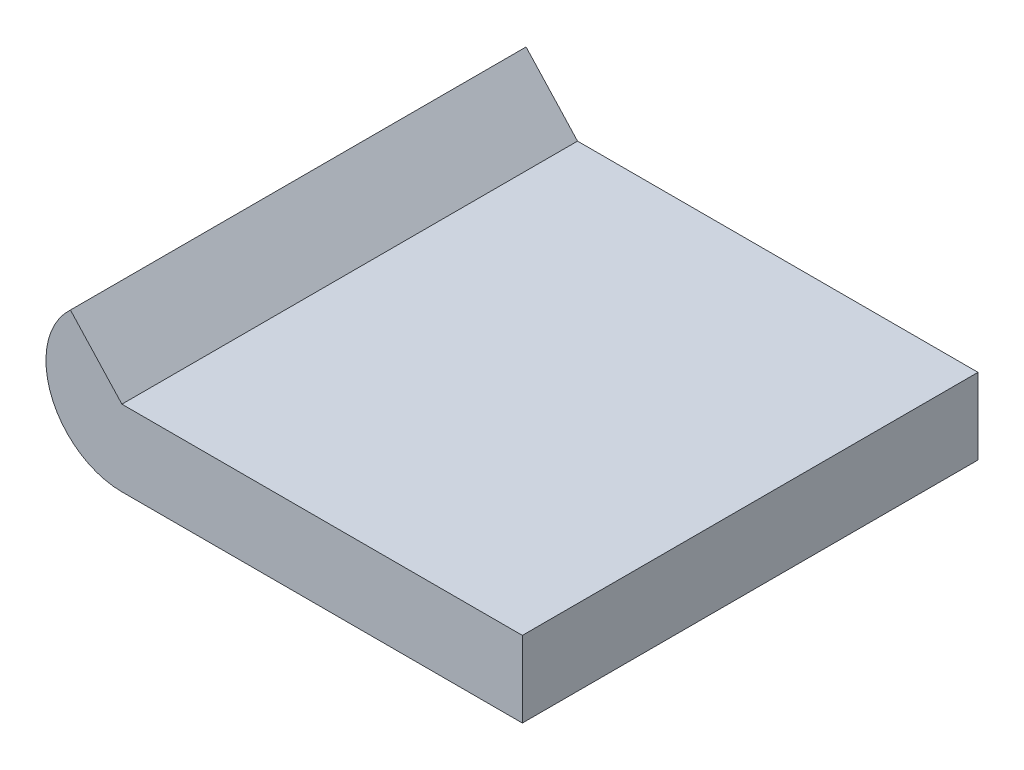
ISO-10303-21;
HEADER;
FILE_DESCRIPTION(('STEP AP214'),'2;1');
FILE_NAME('part.step','',(''),(''),'','','');
FILE_SCHEMA(('AUTOMOTIVE_DESIGN { 1 0 10303 214 1 1 1 1 }'));
ENDSEC;
DATA;
#1=APPLICATION_CONTEXT('core data for automotive mechanical design processes');
#2=APPLICATION_PROTOCOL_DEFINITION('international standard','automotive_design',2000,#1);
#3=PRODUCT_CONTEXT('',#1,'mechanical');
#4=PRODUCT('Part','Part','',(#3));
#5=PRODUCT_RELATED_PRODUCT_CATEGORY('part','',(#4));
#6=PRODUCT_DEFINITION_FORMATION('','',#4);
#7=PRODUCT_DEFINITION_CONTEXT('part definition',#1,'design');
#8=PRODUCT_DEFINITION('design','',#6,#7);
#9=PRODUCT_DEFINITION_SHAPE('','',#8);
#10=(LENGTH_UNIT() NAMED_UNIT(*) SI_UNIT(.MILLI.,.METRE.));
#11=(NAMED_UNIT(*) PLANE_ANGLE_UNIT() SI_UNIT($,.RADIAN.));
#12=(NAMED_UNIT(*) SI_UNIT($,.STERADIAN.) SOLID_ANGLE_UNIT());
#13=UNCERTAINTY_MEASURE_WITH_UNIT(LENGTH_MEASURE(1.E-05),#10,'distance_accuracy_value','');
#14=(GEOMETRIC_REPRESENTATION_CONTEXT(3) GLOBAL_UNCERTAINTY_ASSIGNED_CONTEXT((#13)) GLOBAL_UNIT_ASSIGNED_CONTEXT((#10,
#11,#12)) REPRESENTATION_CONTEXT('',''));
#15=CARTESIAN_POINT('',(0.,0.,0.));
#16=DIRECTION('',(0.,0.,1.));
#17=DIRECTION('',(1.,0.,0.));
#18=AXIS2_PLACEMENT_3D('',#15,#16,#17);
#19=CARTESIAN_POINT('',(-123.82,19.8853755359338,3.));
#20=DIRECTION('',(0.,1.,0.));
#21=DIRECTION('',(-1.,0.,0.));
#22=AXIS2_PLACEMENT_3D('',#19,#20,#21);
#23=PLANE('',#22);
#24=DIRECTION('',(1.,0.,0.));
#25=VECTOR('',#24,1.);
#26=CARTESIAN_POINT('',(-336.32,19.8853755359338,0.));
#27=LINE('',#26,#25);
#28=CARTESIAN_POINT('',(-116.140375406953,19.8853755359338,0.));
#29=VERTEX_POINT('',#28);
#30=CARTESIAN_POINT('',(-100.32,19.8853755359338,0.));
#31=VERTEX_POINT('',#30);
#32=EDGE_CURVE('E1726',#29,#31,#27,.T.);
#33=ORIENTED_EDGE('',*,*,#32,.T.);
#34=DIRECTION('',(0.,0.,1.));
#35=VECTOR('',#34,1.);
#36=CARTESIAN_POINT('',(-100.32,19.8853755359338,-18.87));
#37=LINE('',#36,#35);
#38=CARTESIAN_POINT('',(-100.32,19.8853755359338,18.));
#39=VERTEX_POINT('',#38);
#40=EDGE_CURVE('E1716',#31,#39,#37,.T.);
#41=ORIENTED_EDGE('',*,*,#40,.T.);
#42=DIRECTION('',(-1.,0.,0.));
#43=VECTOR('',#42,1.);
#44=CARTESIAN_POINT('',(-103.32,19.8853755359338,18.));
#45=LINE('',#44,#43);
#46=CARTESIAN_POINT('',(-116.140375406952,19.8853755359338,18.));
#47=VERTEX_POINT('',#46);
#48=EDGE_CURVE('E1720',#39,#47,#45,.T.);
#49=ORIENTED_EDGE('',*,*,#48,.T.);
#50=DIRECTION('',(0.,0.,-1.));
#51=VECTOR('',#50,1.);
#52=CARTESIAN_POINT('',(-116.140375406953,19.8853755359338,3.));
#53=LINE('',#52,#51);
#54=EDGE_CURVE('E1657',#47,#29,#53,.T.);
#55=ORIENTED_EDGE('',*,*,#54,.T.);
#56=EDGE_LOOP('',(#33,#41,#49,#55));
#57=FACE_BOUND('',#56,.T.);
#58=ADVANCED_FACE('F1642',(#57),#23,.F.);
#59=CARTESIAN_POINT('',(-100.32,22.8853755359338,-18.87));
#60=DIRECTION('',(-1.,0.,0.));
#61=DIRECTION('',(0.,-1.,0.));
#62=AXIS2_PLACEMENT_3D('',#59,#60,#61);
#63=PLANE('',#62);
#64=DIRECTION('',(0.,-1.,0.));
#65=VECTOR('',#64,1.);
#66=CARTESIAN_POINT('',(-100.32,22.8853755359338,0.));
#67=LINE('',#66,#65);
#68=CARTESIAN_POINT('',(-100.32,22.8853755359338,0.));
#69=VERTEX_POINT('',#68);
#70=EDGE_CURVE('E1870',#69,#31,#67,.T.);
#71=ORIENTED_EDGE('',*,*,#70,.F.);
#72=DIRECTION('',(0.,0.,1.));
#73=VECTOR('',#72,1.);
#74=CARTESIAN_POINT('',(-100.32,22.8853755359338,-18.87));
#75=LINE('',#74,#73);
#76=CARTESIAN_POINT('',(-100.32,22.8853755359338,18.));
#77=VERTEX_POINT('',#76);
#78=EDGE_CURVE('E1665',#69,#77,#75,.T.);
#79=ORIENTED_EDGE('',*,*,#78,.T.);
#80=DIRECTION('',(0.,-1.,0.));
#81=VECTOR('',#80,1.);
#82=CARTESIAN_POINT('',(-100.32,-113.114624464066,18.));
#83=LINE('',#82,#81);
#84=EDGE_CURVE('E1710',#77,#39,#83,.T.);
#85=ORIENTED_EDGE('',*,*,#84,.T.);
#86=ORIENTED_EDGE('',*,*,#40,.F.);
#87=EDGE_LOOP('',(#71,#79,#85,#86));
#88=FACE_BOUND('',#87,.T.);
#89=ADVANCED_FACE('F1732',(#88),#63,.F.);
#90=CARTESIAN_POINT('',(-116.140375406953,22.8853755359338,3.));
#91=DIRECTION('',(0.,0.,-1.));
#92=DIRECTION('',(-1.,0.,0.));
#93=AXIS2_PLACEMENT_3D('',#90,#91,#92);
#94=CYLINDRICAL_SURFACE('',#93,3.);
#95=ORIENTED_EDGE('',*,*,#54,.F.);
#96=CARTESIAN_POINT('',(-116.140375406953,22.8853755359338,18.));
#97=DIRECTION('',(0.,0.,-1.));
#98=DIRECTION('',(-1.,0.,0.));
#99=AXIS2_PLACEMENT_3D('',#96,#97,#98);
#100=CIRCLE('',#99,3.);
#101=CARTESIAN_POINT('',(-118.173915974705,25.0909849209576,18.));
#102=VERTEX_POINT('',#101);
#103=EDGE_CURVE('E1701',#47,#102,#100,.T.);
#104=ORIENTED_EDGE('',*,*,#103,.T.);
#105=DIRECTION('',(0.,0.,-1.));
#106=VECTOR('',#105,1.);
#107=CARTESIAN_POINT('',(-118.173915974705,25.0909849209576,3.));
#108=LINE('',#107,#106);
#109=CARTESIAN_POINT('',(-118.173915974705,25.0909849209576,0.));
#110=VERTEX_POINT('',#109);
#111=EDGE_CURVE('E13',#110,#102,#108,.F.);
#112=ORIENTED_EDGE('',*,*,#111,.F.);
#113=CARTESIAN_POINT('',(-116.140375406953,22.8853755359338,0.));
#114=DIRECTION('',(0.,0.,-1.));
#115=DIRECTION('',(-1.,0.,0.));
#116=AXIS2_PLACEMENT_3D('',#113,#114,#115);
#117=CIRCLE('',#116,3.);
#118=EDGE_CURVE('E1650',#29,#110,#117,.T.);
#119=ORIENTED_EDGE('',*,*,#118,.F.);
#120=EDGE_LOOP('',(#95,#104,#112,#119));
#121=FACE_BOUND('',#120,.T.);
#122=ADVANCED_FACE('F1644',(#121),#94,.T.);
#123=CARTESIAN_POINT('',(-100.32,22.8853755359338,-18.87));
#124=DIRECTION('',(0.,1.,0.));
#125=DIRECTION('',(0.,0.,1.));
#126=AXIS2_PLACEMENT_3D('',#123,#124,#125);
#127=PLANE('',#126);
#128=ORIENTED_EDGE('',*,*,#78,.F.);
#129=DIRECTION('',(1.,0.,0.));
#130=VECTOR('',#129,1.);
#131=CARTESIAN_POINT('',(-100.32,22.8853755359338,0.));
#132=LINE('',#131,#130);
#133=CARTESIAN_POINT('',(-116.140375406953,22.8853755359338,0.));
#134=VERTEX_POINT('',#133);
#135=EDGE_CURVE('E1702',#134,#69,#132,.T.);
#136=ORIENTED_EDGE('',*,*,#135,.F.);
#137=DIRECTION('',(0.,0.,1.));
#138=VECTOR('',#137,1.);
#139=CARTESIAN_POINT('',(-116.140375406953,22.8853755359338,0.));
#140=LINE('',#139,#138);
#141=CARTESIAN_POINT('',(-116.140375406953,22.8853755359338,18.));
#142=VERTEX_POINT('',#141);
#143=EDGE_CURVE('E1691',#134,#142,#140,.T.);
#144=ORIENTED_EDGE('',*,*,#143,.T.);
#145=DIRECTION('',(1.,0.,0.));
#146=VECTOR('',#145,1.);
#147=CARTESIAN_POINT('',(-100.32,22.8853755359338,18.));
#148=LINE('',#147,#146);
#149=EDGE_CURVE('E1712',#142,#77,#148,.T.);
#150=ORIENTED_EDGE('',*,*,#149,.T.);
#151=EDGE_LOOP('',(#128,#136,#144,#150));
#152=FACE_BOUND('',#151,.T.);
#153=ADVANCED_FACE('F1709',(#152),#127,.T.);
#154=CARTESIAN_POINT('',(0.,0.,0.));
#155=DIRECTION('',(0.,0.,-1.));
#156=DIRECTION('',(-1.,0.,0.));
#157=AXIS2_PLACEMENT_3D('',#154,#155,#156);
#158=PLANE('',#157);
#159=DIRECTION('',(-0.67784685591748,0.735203128341268,0.));
#160=VECTOR('',#159,1.);
#161=CARTESIAN_POINT('',(-118.173915974705,25.0909849209576,0.));
#162=LINE('',#161,#160);
#163=EDGE_CURVE('E1694',#134,#110,#162,.T.);
#164=ORIENTED_EDGE('',*,*,#163,.F.);
#165=ORIENTED_EDGE('',*,*,#135,.T.);
#166=ORIENTED_EDGE('',*,*,#70,.T.);
#167=ORIENTED_EDGE('',*,*,#32,.F.);
#168=ORIENTED_EDGE('',*,*,#118,.T.);
#169=EDGE_LOOP('',(#164,#165,#166,#167,#168));
#170=FACE_BOUND('',#169,.T.);
#171=ADVANCED_FACE('F1705',(#170),#158,.T.);
#172=CARTESIAN_POINT('',(-116.140375406953,22.8853755359338,18.));
#173=DIRECTION('',(0.,0.,-1.));
#174=DIRECTION('',(-1.,0.,0.));
#175=AXIS2_PLACEMENT_3D('',#172,#173,#174);
#176=PLANE('',#175);
#177=ORIENTED_EDGE('',*,*,#149,.F.);
#178=DIRECTION('',(-0.67784685591748,0.735203128341268,0.));
#179=VECTOR('',#178,1.);
#180=CARTESIAN_POINT('',(-116.140375406953,22.8853755359338,18.));
#181=LINE('',#180,#179);
#182=EDGE_CURVE('E1697',#142,#102,#181,.T.);
#183=ORIENTED_EDGE('',*,*,#182,.T.);
#184=ORIENTED_EDGE('',*,*,#103,.F.);
#185=ORIENTED_EDGE('',*,*,#48,.F.);
#186=ORIENTED_EDGE('',*,*,#84,.F.);
#187=EDGE_LOOP('',(#177,#183,#184,#185,#186));
#188=FACE_BOUND('',#187,.T.);
#189=ADVANCED_FACE('F1730',(#188),#176,.F.);
#190=CARTESIAN_POINT('',(-118.173915974705,25.0909849209576,263.));
#191=DIRECTION('',(-0.735203128341268,-0.67784685591748,0.));
#192=DIRECTION('',(0.67784685591748,-0.735203128341268,0.));
#193=AXIS2_PLACEMENT_3D('',#190,#191,#192);
#194=PLANE('',#193);
#195=ORIENTED_EDGE('',*,*,#143,.F.);
#196=ORIENTED_EDGE('',*,*,#163,.T.);
#197=ORIENTED_EDGE('',*,*,#111,.T.);
#198=ORIENTED_EDGE('',*,*,#182,.F.);
#199=EDGE_LOOP('',(#195,#196,#197,#198));
#200=FACE_BOUND('',#199,.T.);
#201=ADVANCED_FACE('F1693',(#200),#194,.F.);
#202=CLOSED_SHELL('',(#58,#89,#122,#153,#171,#189,#201));
#203=MANIFOLD_SOLID_BREP('B2',#202);
#204=ADVANCED_BREP_SHAPE_REPRESENTATION('',(#18,#203),#14);
#205=SHAPE_DEFINITION_REPRESENTATION(#9,#204);
ENDSEC;
END-ISO-10303-21;
